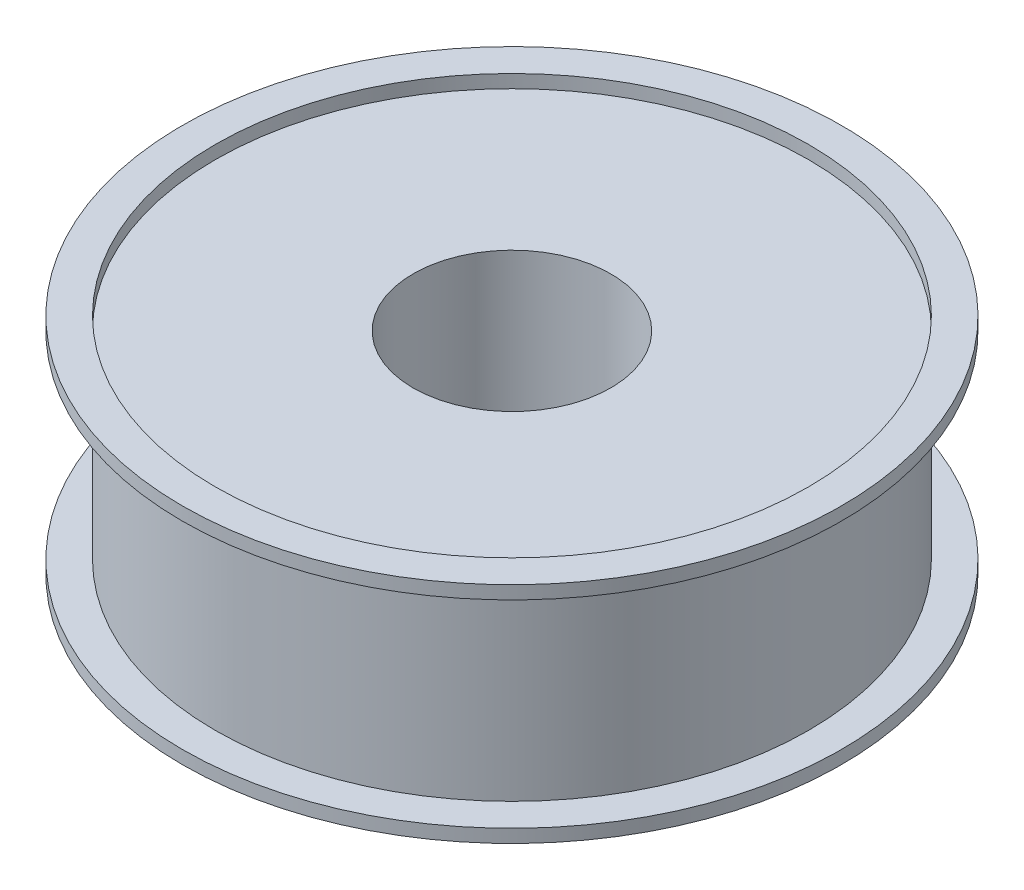
ISO-10303-21;
HEADER;
FILE_DESCRIPTION(('STEP AP214'),'2;1');
FILE_NAME('part.step','',(''),(''),'','','');
FILE_SCHEMA(('AUTOMOTIVE_DESIGN { 1 0 10303 214 1 1 1 1 }'));
ENDSEC;
DATA;
#1=APPLICATION_CONTEXT('core data for automotive mechanical design processes');
#2=APPLICATION_PROTOCOL_DEFINITION('international standard','automotive_design',2000,#1);
#3=PRODUCT_CONTEXT('',#1,'mechanical');
#4=PRODUCT('Part','Part','',(#3));
#5=PRODUCT_RELATED_PRODUCT_CATEGORY('part','',(#4));
#6=PRODUCT_DEFINITION_FORMATION('','',#4);
#7=PRODUCT_DEFINITION_CONTEXT('part definition',#1,'design');
#8=PRODUCT_DEFINITION('design','',#6,#7);
#9=PRODUCT_DEFINITION_SHAPE('','',#8);
#10=(LENGTH_UNIT() NAMED_UNIT(*) SI_UNIT(.MILLI.,.METRE.));
#11=(NAMED_UNIT(*) PLANE_ANGLE_UNIT() SI_UNIT($,.RADIAN.));
#12=(NAMED_UNIT(*) SI_UNIT($,.STERADIAN.) SOLID_ANGLE_UNIT());
#13=UNCERTAINTY_MEASURE_WITH_UNIT(LENGTH_MEASURE(1.E-05),#10,'distance_accuracy_value','');
#14=(GEOMETRIC_REPRESENTATION_CONTEXT(3) GLOBAL_UNCERTAINTY_ASSIGNED_CONTEXT((#13)) GLOBAL_UNIT_ASSIGNED_CONTEXT((#10,
#11,#12)) REPRESENTATION_CONTEXT('',''));
#15=CARTESIAN_POINT('',(0.,0.,0.));
#16=DIRECTION('',(0.,0.,1.));
#17=DIRECTION('',(1.,0.,0.));
#18=AXIS2_PLACEMENT_3D('',#15,#16,#17);
#19=CARTESIAN_POINT('',(0.,64.,0.));
#20=DIRECTION('',(0.,-1.,0.));
#21=DIRECTION('',(0.,0.,-1.));
#22=AXIS2_PLACEMENT_3D('',#19,#20,#21);
#23=CYLINDRICAL_SURFACE('',#22,30.);
#24=CARTESIAN_POINT('',(0.,4.,0.));
#25=DIRECTION('',(0.,1.,0.));
#26=DIRECTION('',(0.,0.,1.));
#27=AXIS2_PLACEMENT_3D('',#24,#25,#26);
#28=CIRCLE('',#27,30.);
#29=CARTESIAN_POINT('',(0.,4.,30.));
#30=VERTEX_POINT('',#29);
#31=EDGE_CURVE('E54',#30,#30,#28,.T.);
#32=ORIENTED_EDGE('',*,*,#31,.F.);
#33=EDGE_LOOP('',(#32));
#34=FACE_BOUND('',#33,.T.);
#35=CARTESIAN_POINT('',(0.,64.,0.));
#36=DIRECTION('',(0.,1.,0.));
#37=DIRECTION('',(0.,0.,1.));
#38=AXIS2_PLACEMENT_3D('',#35,#36,#37);
#39=CIRCLE('',#38,30.);
#40=CARTESIAN_POINT('',(0.,64.,30.));
#41=VERTEX_POINT('',#40);
#42=EDGE_CURVE('E59',#41,#41,#39,.T.);
#43=ORIENTED_EDGE('',*,*,#42,.T.);
#44=EDGE_LOOP('',(#43));
#45=FACE_BOUND('',#44,.T.);
#46=ADVANCED_FACE('F43',(#34,#45),#23,.F.);
#47=CARTESIAN_POINT('',(0.,4.,0.));
#48=DIRECTION('',(0.,1.,0.));
#49=DIRECTION('',(0.,0.,1.));
#50=AXIS2_PLACEMENT_3D('',#47,#48,#49);
#51=PLANE('',#50);
#52=CARTESIAN_POINT('',(0.,4.,0.));
#53=DIRECTION('',(0.,1.,0.));
#54=DIRECTION('',(0.,0.,1.));
#55=AXIS2_PLACEMENT_3D('',#52,#53,#54);
#56=CIRCLE('',#55,90.);
#57=CARTESIAN_POINT('',(0.,4.,90.));
#58=VERTEX_POINT('',#57);
#59=EDGE_CURVE('E50',#58,#58,#56,.T.);
#60=ORIENTED_EDGE('',*,*,#59,.F.);
#61=EDGE_LOOP('',(#60));
#62=FACE_BOUND('',#61,.T.);
#63=ORIENTED_EDGE('',*,*,#31,.T.);
#64=EDGE_LOOP('',(#63));
#65=FACE_BOUND('',#64,.T.);
#66=ADVANCED_FACE('F70',(#62,#65),#51,.F.);
#67=CARTESIAN_POINT('',(0.,64.,0.));
#68=DIRECTION('',(0.,-1.,0.));
#69=DIRECTION('',(0.,0.,-1.));
#70=AXIS2_PLACEMENT_3D('',#67,#68,#69);
#71=CYLINDRICAL_SURFACE('',#70,90.);
#72=CARTESIAN_POINT('',(0.,64.,0.));
#73=DIRECTION('',(0.,1.,0.));
#74=DIRECTION('',(0.,0.,1.));
#75=AXIS2_PLACEMENT_3D('',#72,#73,#74);
#76=CIRCLE('',#75,90.);
#77=CARTESIAN_POINT('',(0.,64.,90.));
#78=VERTEX_POINT('',#77);
#79=EDGE_CURVE('E11',#78,#78,#76,.T.);
#80=ORIENTED_EDGE('',*,*,#79,.F.);
#81=EDGE_LOOP('',(#80));
#82=FACE_BOUND('',#81,.T.);
#83=ORIENTED_EDGE('',*,*,#59,.T.);
#84=EDGE_LOOP('',(#83));
#85=FACE_BOUND('',#84,.T.);
#86=ADVANCED_FACE('F66',(#82,#85),#71,.T.);
#87=CARTESIAN_POINT('',(0.,64.,0.));
#88=DIRECTION('',(0.,1.,0.));
#89=DIRECTION('',(0.,0.,1.));
#90=AXIS2_PLACEMENT_3D('',#87,#88,#89);
#91=PLANE('',#90);
#92=ORIENTED_EDGE('',*,*,#42,.F.);
#93=EDGE_LOOP('',(#92));
#94=FACE_BOUND('',#93,.T.);
#95=ORIENTED_EDGE('',*,*,#79,.T.);
#96=EDGE_LOOP('',(#95));
#97=FACE_BOUND('',#96,.T.);
#98=ADVANCED_FACE('F45',(#94,#97),#91,.T.);
#99=CLOSED_SHELL('',(#46,#66,#86,#98));
#100=MANIFOLD_SOLID_BREP('B2',#99);
#101=CARTESIAN_POINT('',(0.,64.,0.));
#102=DIRECTION('',(0.,1.,0.));
#103=DIRECTION('',(0.,0.,1.));
#104=AXIS2_PLACEMENT_3D('',#101,#102,#103);
#105=PLANE('',#104);
#106=CARTESIAN_POINT('',(0.,64.,0.));
#107=DIRECTION('',(0.,1.,0.));
#108=DIRECTION('',(0.,0.,1.));
#109=AXIS2_PLACEMENT_3D('',#106,#107,#108);
#110=CIRCLE('',#109,100.);
#111=CARTESIAN_POINT('',(0.,64.,100.));
#112=VERTEX_POINT('',#111);
#113=EDGE_CURVE('E118',#112,#112,#110,.T.);
#114=ORIENTED_EDGE('',*,*,#113,.F.);
#115=EDGE_LOOP('',(#114));
#116=FACE_BOUND('',#115,.T.);
#117=CARTESIAN_POINT('',(0.,64.,0.));
#118=DIRECTION('',(0.,1.,0.));
#119=DIRECTION('',(0.,0.,1.));
#120=AXIS2_PLACEMENT_3D('',#117,#118,#119);
#121=CIRCLE('',#120,90.);
#122=CARTESIAN_POINT('',(0.,64.,90.));
#123=VERTEX_POINT('',#122);
#124=EDGE_CURVE('E125',#123,#123,#121,.T.);
#125=ORIENTED_EDGE('',*,*,#124,.T.);
#126=EDGE_LOOP('',(#125));
#127=FACE_BOUND('',#126,.T.);
#128=ADVANCED_FACE('F114',(#116,#127),#105,.F.);
#129=CARTESIAN_POINT('',(0.,68.,0.));
#130=DIRECTION('',(0.,-1.,0.));
#131=DIRECTION('',(0.,0.,-1.));
#132=AXIS2_PLACEMENT_3D('',#129,#130,#131);
#133=CYLINDRICAL_SURFACE('',#132,100.);
#134=CARTESIAN_POINT('',(0.,68.,0.));
#135=DIRECTION('',(0.,1.,0.));
#136=DIRECTION('',(0.,0.,1.));
#137=AXIS2_PLACEMENT_3D('',#134,#135,#136);
#138=CIRCLE('',#137,100.);
#139=CARTESIAN_POINT('',(0.,68.,100.));
#140=VERTEX_POINT('',#139);
#141=EDGE_CURVE('E42',#140,#140,#138,.T.);
#142=ORIENTED_EDGE('',*,*,#141,.F.);
#143=EDGE_LOOP('',(#142));
#144=FACE_BOUND('',#143,.T.);
#145=ORIENTED_EDGE('',*,*,#113,.T.);
#146=EDGE_LOOP('',(#145));
#147=FACE_BOUND('',#146,.T.);
#148=ADVANCED_FACE('F116',(#144,#147),#133,.T.);
#149=CARTESIAN_POINT('',(0.,68.,0.));
#150=DIRECTION('',(0.,1.,0.));
#151=DIRECTION('',(0.,0.,1.));
#152=AXIS2_PLACEMENT_3D('',#149,#150,#151);
#153=PLANE('',#152);
#154=CARTESIAN_POINT('',(0.,68.,0.));
#155=DIRECTION('',(0.,1.,0.));
#156=DIRECTION('',(0.,0.,1.));
#157=AXIS2_PLACEMENT_3D('',#154,#155,#156);
#158=CIRCLE('',#157,90.);
#159=CARTESIAN_POINT('',(0.,68.,90.));
#160=VERTEX_POINT('',#159);
#161=EDGE_CURVE('E127',#160,#160,#158,.T.);
#162=ORIENTED_EDGE('',*,*,#161,.F.);
#163=EDGE_LOOP('',(#162));
#164=FACE_BOUND('',#163,.T.);
#165=ORIENTED_EDGE('',*,*,#141,.T.);
#166=EDGE_LOOP('',(#165));
#167=FACE_BOUND('',#166,.T.);
#168=ADVANCED_FACE('F137',(#164,#167),#153,.T.);
#169=CARTESIAN_POINT('',(0.,64.,0.));
#170=DIRECTION('',(0.,1.,0.));
#171=DIRECTION('',(0.,0.,1.));
#172=AXIS2_PLACEMENT_3D('',#169,#170,#171);
#173=CYLINDRICAL_SURFACE('',#172,90.);
#174=ORIENTED_EDGE('',*,*,#124,.F.);
#175=EDGE_LOOP('',(#174));
#176=FACE_BOUND('',#175,.T.);
#177=ORIENTED_EDGE('',*,*,#161,.T.);
#178=EDGE_LOOP('',(#177));
#179=FACE_BOUND('',#178,.T.);
#180=ADVANCED_FACE('F134',(#176,#179),#173,.F.);
#181=CLOSED_SHELL('',(#128,#148,#168,#180));
#182=MANIFOLD_SOLID_BREP('B6',#181);
#183=CARTESIAN_POINT('',(0.,4.,0.));
#184=DIRECTION('',(0.,-1.,0.));
#185=DIRECTION('',(0.,0.,-1.));
#186=AXIS2_PLACEMENT_3D('',#183,#184,#185);
#187=CYLINDRICAL_SURFACE('',#186,90.);
#188=CARTESIAN_POINT('',(0.,4.,0.));
#189=DIRECTION('',(0.,1.,0.));
#190=DIRECTION('',(0.,0.,1.));
#191=AXIS2_PLACEMENT_3D('',#188,#189,#190);
#192=CIRCLE('',#191,90.);
#193=CARTESIAN_POINT('',(0.,4.,90.));
#194=VERTEX_POINT('',#193);
#195=EDGE_CURVE('E182',#194,#194,#192,.T.);
#196=ORIENTED_EDGE('',*,*,#195,.T.);
#197=EDGE_LOOP('',(#196));
#198=FACE_BOUND('',#197,.T.);
#199=CARTESIAN_POINT('',(0.,0.,0.));
#200=DIRECTION('',(0.,1.,0.));
#201=DIRECTION('',(0.,0.,1.));
#202=AXIS2_PLACEMENT_3D('',#199,#200,#201);
#203=CIRCLE('',#202,90.);
#204=CARTESIAN_POINT('',(0.,0.,90.));
#205=VERTEX_POINT('',#204);
#206=EDGE_CURVE('E188',#205,#205,#203,.T.);
#207=ORIENTED_EDGE('',*,*,#206,.F.);
#208=EDGE_LOOP('',(#207));
#209=FACE_BOUND('',#208,.T.);
#210=ADVANCED_FACE('F175',(#198,#209),#187,.F.);
#211=CARTESIAN_POINT('',(0.,4.,0.));
#212=DIRECTION('',(0.,-1.,0.));
#213=DIRECTION('',(0.,0.,-1.));
#214=AXIS2_PLACEMENT_3D('',#211,#212,#213);
#215=CYLINDRICAL_SURFACE('',#214,100.);
#216=CARTESIAN_POINT('',(0.,4.,0.));
#217=DIRECTION('',(0.,1.,0.));
#218=DIRECTION('',(0.,0.,1.));
#219=AXIS2_PLACEMENT_3D('',#216,#217,#218);
#220=CIRCLE('',#219,100.);
#221=CARTESIAN_POINT('',(0.,4.,100.));
#222=VERTEX_POINT('',#221);
#223=EDGE_CURVE('E113',#222,#222,#220,.T.);
#224=ORIENTED_EDGE('',*,*,#223,.F.);
#225=EDGE_LOOP('',(#224));
#226=FACE_BOUND('',#225,.T.);
#227=CARTESIAN_POINT('',(0.,0.,0.));
#228=DIRECTION('',(0.,1.,0.));
#229=DIRECTION('',(0.,0.,1.));
#230=AXIS2_PLACEMENT_3D('',#227,#228,#229);
#231=CIRCLE('',#230,100.);
#232=CARTESIAN_POINT('',(0.,0.,100.));
#233=VERTEX_POINT('',#232);
#234=EDGE_CURVE('E178',#233,#233,#231,.T.);
#235=ORIENTED_EDGE('',*,*,#234,.T.);
#236=EDGE_LOOP('',(#235));
#237=FACE_BOUND('',#236,.T.);
#238=ADVANCED_FACE('F195',(#226,#237),#215,.T.);
#239=CARTESIAN_POINT('',(0.,4.,0.));
#240=DIRECTION('',(0.,1.,0.));
#241=DIRECTION('',(0.,0.,1.));
#242=AXIS2_PLACEMENT_3D('',#239,#240,#241);
#243=PLANE('',#242);
#244=ORIENTED_EDGE('',*,*,#195,.F.);
#245=EDGE_LOOP('',(#244));
#246=FACE_BOUND('',#245,.T.);
#247=ORIENTED_EDGE('',*,*,#223,.T.);
#248=EDGE_LOOP('',(#247));
#249=FACE_BOUND('',#248,.T.);
#250=ADVANCED_FACE('F199',(#246,#249),#243,.T.);
#251=CARTESIAN_POINT('',(0.,0.,0.));
#252=DIRECTION('',(0.,1.,0.));
#253=DIRECTION('',(0.,0.,1.));
#254=AXIS2_PLACEMENT_3D('',#251,#252,#253);
#255=PLANE('',#254);
#256=ORIENTED_EDGE('',*,*,#206,.T.);
#257=EDGE_LOOP('',(#256));
#258=FACE_BOUND('',#257,.T.);
#259=ORIENTED_EDGE('',*,*,#234,.F.);
#260=EDGE_LOOP('',(#259));
#261=FACE_BOUND('',#260,.T.);
#262=ADVANCED_FACE('F197',(#258,#261),#255,.F.);
#263=CLOSED_SHELL('',(#210,#238,#250,#262));
#264=MANIFOLD_SOLID_BREP('B37',#263);
#265=ADVANCED_BREP_SHAPE_REPRESENTATION('',(#18,#100,#182,#264),#14);
#266=SHAPE_DEFINITION_REPRESENTATION(#9,#265);
ENDSEC;
END-ISO-10303-21;
